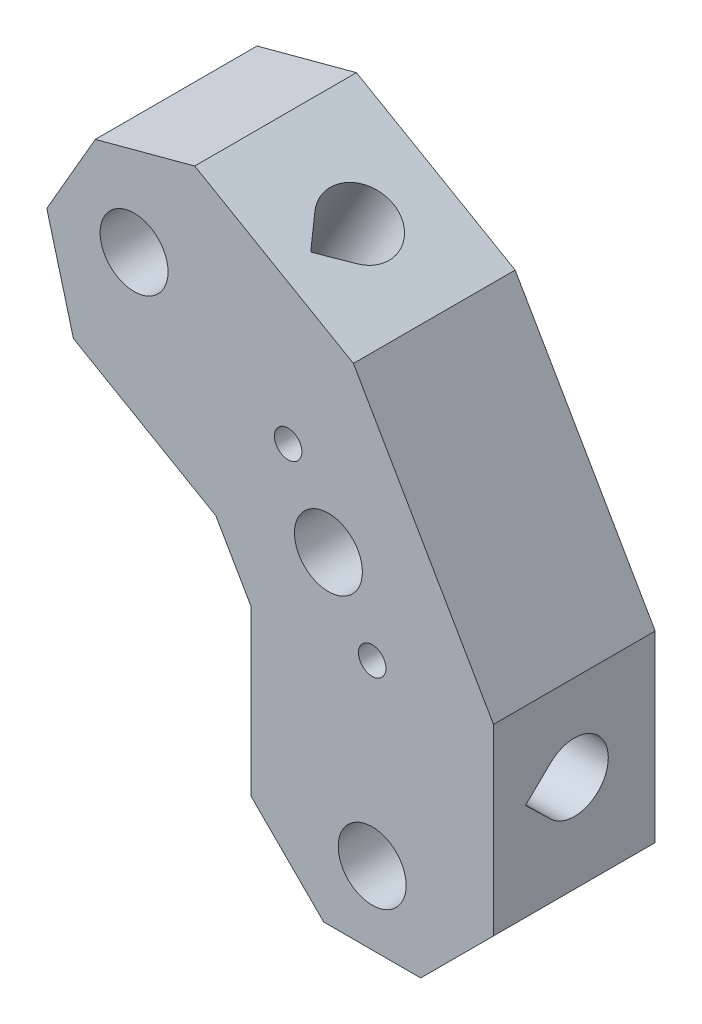
ISO-10303-21;
HEADER;
FILE_DESCRIPTION(('STEP AP214'),'2;1');
FILE_NAME('part.step','',(''),(''),'','','');
FILE_SCHEMA(('AUTOMOTIVE_DESIGN { 1 0 10303 214 1 1 1 1 }'));
ENDSEC;
DATA;
#1=APPLICATION_CONTEXT('core data for automotive mechanical design processes');
#2=APPLICATION_PROTOCOL_DEFINITION('international standard','automotive_design',2000,#1);
#3=PRODUCT_CONTEXT('',#1,'mechanical');
#4=PRODUCT('Part','Part','',(#3));
#5=PRODUCT_RELATED_PRODUCT_CATEGORY('part','',(#4));
#6=PRODUCT_DEFINITION_FORMATION('','',#4);
#7=PRODUCT_DEFINITION_CONTEXT('part definition',#1,'design');
#8=PRODUCT_DEFINITION('design','',#6,#7);
#9=PRODUCT_DEFINITION_SHAPE('','',#8);
#10=(LENGTH_UNIT() NAMED_UNIT(*) SI_UNIT(.MILLI.,.METRE.));
#11=(NAMED_UNIT(*) PLANE_ANGLE_UNIT() SI_UNIT($,.RADIAN.));
#12=(NAMED_UNIT(*) SI_UNIT($,.STERADIAN.) SOLID_ANGLE_UNIT());
#13=UNCERTAINTY_MEASURE_WITH_UNIT(LENGTH_MEASURE(1.E-05),#10,'distance_accuracy_value','');
#14=(GEOMETRIC_REPRESENTATION_CONTEXT(3) GLOBAL_UNCERTAINTY_ASSIGNED_CONTEXT((#13)) GLOBAL_UNIT_ASSIGNED_CONTEXT((#10,
#11,#12)) REPRESENTATION_CONTEXT('',''));
#15=CARTESIAN_POINT('',(0.,0.,0.));
#16=DIRECTION('',(0.,0.,1.));
#17=DIRECTION('',(1.,0.,0.));
#18=AXIS2_PLACEMENT_3D('',#15,#16,#17);
#19=CARTESIAN_POINT('',(0.,-49.,20.));
#20=DIRECTION('',(0.,0.,-1.));
#21=DIRECTION('',(-1.,0.,0.));
#22=AXIS2_PLACEMENT_3D('',#19,#20,#21);
#23=PLANE('',#22);
#24=CARTESIAN_POINT('',(0.,-34.,20.));
#25=DIRECTION('',(0.,0.,1.));
#26=DIRECTION('',(1.,0.,0.));
#27=AXIS2_PLACEMENT_3D('',#24,#25,#26);
#28=CIRCLE('',#27,4.20000000000001);
#29=CARTESIAN_POINT('',(4.20000000000001,-34.,20.));
#30=VERTEX_POINT('',#29);
#31=EDGE_CURVE('E473',#30,#30,#28,.T.);
#32=ORIENTED_EDGE('',*,*,#31,.F.);
#33=EDGE_LOOP('',(#32));
#34=FACE_BOUND('',#33,.T.);
#35=CARTESIAN_POINT('',(-29.4448637286709,17.,20.));
#36=DIRECTION('',(0.,0.,1.));
#37=DIRECTION('',(1.,0.,0.));
#38=AXIS2_PLACEMENT_3D('',#35,#36,#37);
#39=CIRCLE('',#38,4.20000000000002);
#40=CARTESIAN_POINT('',(-25.2448637286709,17.,20.));
#41=VERTEX_POINT('',#40);
#42=EDGE_CURVE('E469',#41,#41,#39,.T.);
#43=ORIENTED_EDGE('',*,*,#42,.F.);
#44=EDGE_LOOP('',(#43));
#45=FACE_BOUND('',#44,.T.);
#46=CARTESIAN_POINT('',(-5.41265877365275,-3.125,20.));
#47=DIRECTION('',(0.,0.,1.));
#48=DIRECTION('',(1.,0.,0.));
#49=AXIS2_PLACEMENT_3D('',#46,#47,#48);
#50=CIRCLE('',#49,4.20000000000001);
#51=CARTESIAN_POINT('',(-1.21265877365273,-3.125,20.));
#52=VERTEX_POINT('',#51);
#53=EDGE_CURVE('E465',#52,#52,#50,.T.);
#54=ORIENTED_EDGE('',*,*,#53,.F.);
#55=EDGE_LOOP('',(#54));
#56=FACE_BOUND('',#55,.T.);
#57=CARTESIAN_POINT('',(-10.3923048454133,5.99999999999996,20.));
#58=DIRECTION('',(0.,0.,1.));
#59=DIRECTION('',(1.,0.,0.));
#60=AXIS2_PLACEMENT_3D('',#57,#58,#59);
#61=CIRCLE('',#60,1.70000000000001);
#62=CARTESIAN_POINT('',(-8.69230484541329,5.99999999999996,20.));
#63=VERTEX_POINT('',#62);
#64=EDGE_CURVE('E461',#63,#63,#61,.T.);
#65=ORIENTED_EDGE('',*,*,#64,.F.);
#66=EDGE_LOOP('',(#65));
#67=FACE_BOUND('',#66,.T.);
#68=DIRECTION('',(0.707106781186547,-0.707106781186548,0.));
#69=VECTOR('',#68,1.);
#70=CARTESIAN_POINT('',(-15.,-34.,20.));
#71=LINE('',#70,#69);
#72=CARTESIAN_POINT('',(-15.,-34.,20.));
#73=VERTEX_POINT('',#72);
#74=CARTESIAN_POINT('',(-6.00000000000002,-43.,20.));
#75=VERTEX_POINT('',#74);
#76=EDGE_CURVE('E206',#73,#75,#71,.T.);
#77=ORIENTED_EDGE('',*,*,#76,.T.);
#78=DIRECTION('',(-1.,0.,0.));
#79=VECTOR('',#78,1.);
#80=CARTESIAN_POINT('',(-6.00000000000002,-43.,20.));
#81=LINE('',#80,#79);
#82=CARTESIAN_POINT('',(5.99999999999998,-43.,20.));
#83=VERTEX_POINT('',#82);
#84=EDGE_CURVE('E52',#75,#83,#81,.F.);
#85=ORIENTED_EDGE('',*,*,#84,.T.);
#86=DIRECTION('',(0.707106781186548,0.707106781186547,0.));
#87=VECTOR('',#86,1.);
#88=CARTESIAN_POINT('',(0.,-49.,20.));
#89=LINE('',#88,#87);
#90=CARTESIAN_POINT('',(15.,-34.,20.));
#91=VERTEX_POINT('',#90);
#92=EDGE_CURVE('E198',#83,#91,#89,.T.);
#93=ORIENTED_EDGE('',*,*,#92,.T.);
#94=DIRECTION('',(0.,1.,0.));
#95=VECTOR('',#94,1.);
#96=CARTESIAN_POINT('',(15.,-34.,20.));
#97=LINE('',#96,#95);
#98=CARTESIAN_POINT('',(15.,-11.3397459621556,20.));
#99=VERTEX_POINT('',#98);
#100=EDGE_CURVE('E230',#91,#99,#97,.T.);
#101=ORIENTED_EDGE('',*,*,#100,.T.);
#102=DIRECTION('',(-0.5,0.866025403784438,0.));
#103=VECTOR('',#102,1.);
#104=CARTESIAN_POINT('',(15.,-11.3397459621556,20.));
#105=LINE('',#104,#103);
#106=CARTESIAN_POINT('',(-2.32050807568878,18.6602540378444,20.));
#107=VERTEX_POINT('',#106);
#108=EDGE_CURVE('E233',#99,#107,#105,.T.);
#109=ORIENTED_EDGE('',*,*,#108,.T.);
#110=DIRECTION('',(-0.866025403784439,0.499999999999999,0.));
#111=VECTOR('',#110,1.);
#112=CARTESIAN_POINT('',(-2.32050807568878,18.6602540378444,20.));
#113=LINE('',#112,#111);
#114=CARTESIAN_POINT('',(-21.944863728671,29.9903810567666,20.));
#115=VERTEX_POINT('',#114);
#116=EDGE_CURVE('E236',#107,#115,#113,.T.);
#117=ORIENTED_EDGE('',*,*,#116,.T.);
#118=DIRECTION('',(-0.965925826289068,-0.258819045102522,0.));
#119=VECTOR('',#118,1.);
#120=CARTESIAN_POINT('',(-21.944863728671,29.9903810567666,20.));
#121=LINE('',#120,#119);
#122=CARTESIAN_POINT('',(-34.2390923627309,26.6961524227066,20.));
#123=VERTEX_POINT('',#122);
#124=EDGE_CURVE('E239',#115,#123,#121,.T.);
#125=ORIENTED_EDGE('',*,*,#124,.T.);
#126=DIRECTION('',(0.500000000000001,0.866025403784438,0.));
#127=VECTOR('',#126,1.);
#128=CARTESIAN_POINT('',(-34.2390923627309,26.6961524227066,20.));
#129=LINE('',#128,#127);
#130=CARTESIAN_POINT('',(-40.2390923627309,16.3038475772933,20.));
#131=VERTEX_POINT('',#130);
#132=EDGE_CURVE('E274',#123,#131,#129,.F.);
#133=ORIENTED_EDGE('',*,*,#132,.T.);
#134=DIRECTION('',(0.258819045102522,-0.965925826289068,0.));
#135=VECTOR('',#134,1.);
#136=CARTESIAN_POINT('',(-42.4352447854376,24.5,20.));
#137=LINE('',#136,#135);
#138=CARTESIAN_POINT('',(-36.9448637286709,4.00961894323339,20.));
#139=VERTEX_POINT('',#138);
#140=EDGE_CURVE('E242',#131,#139,#137,.T.);
#141=ORIENTED_EDGE('',*,*,#140,.T.);
#142=DIRECTION('',(0.866025403784439,-0.499999999999999,0.));
#143=VECTOR('',#142,1.);
#144=CARTESIAN_POINT('',(-36.9448637286709,4.00961894323339,20.));
#145=LINE('',#144,#143);
#146=CARTESIAN_POINT('',(-19.3301270189222,-6.16025403784441,20.));
#147=VERTEX_POINT('',#146);
#148=EDGE_CURVE('E244',#139,#147,#145,.T.);
#149=ORIENTED_EDGE('',*,*,#148,.T.);
#150=DIRECTION('',(-0.499999999999998,0.86602540378444,0.));
#151=VECTOR('',#150,1.);
#152=CARTESIAN_POINT('',(4.05255888325756,-46.6602540378445,20.));
#153=LINE('',#152,#151);
#154=CARTESIAN_POINT('',(-15.,-13.6602540378444,20.));
#155=VERTEX_POINT('',#154);
#156=EDGE_CURVE('E285',#147,#155,#153,.F.);
#157=ORIENTED_EDGE('',*,*,#156,.T.);
#158=DIRECTION('',(0.,-1.,0.));
#159=VECTOR('',#158,1.);
#160=CARTESIAN_POINT('',(-15.,-8.66025403784439,20.));
#161=LINE('',#160,#159);
#162=EDGE_CURVE('E247',#155,#73,#161,.T.);
#163=ORIENTED_EDGE('',*,*,#162,.T.);
#164=EDGE_LOOP('',(#77,#85,#93,#101,#109,#117,#125,#133,#141,#149,#157,#163));
#165=FACE_BOUND('',#164,.T.);
#166=CARTESIAN_POINT('',(0.,-12.,20.));
#167=DIRECTION('',(0.,0.,1.));
#168=DIRECTION('',(1.,0.,0.));
#169=AXIS2_PLACEMENT_3D('',#166,#167,#168);
#170=CIRCLE('',#169,1.70000000000001);
#171=CARTESIAN_POINT('',(1.69999999999997,-12.,20.));
#172=VERTEX_POINT('',#171);
#173=EDGE_CURVE('E455',#172,#172,#170,.T.);
#174=ORIENTED_EDGE('',*,*,#173,.F.);
#175=EDGE_LOOP('',(#174));
#176=FACE_BOUND('',#175,.T.);
#177=ADVANCED_FACE('F30',(#34,#45,#56,#67,#165,#176),#23,.F.);
#178=CARTESIAN_POINT('',(0.,-49.,0.));
#179=DIRECTION('',(0.707106781186548,-0.707106781186548,0.));
#180=DIRECTION('',(0.707106781186548,0.707106781186548,0.));
#181=AXIS2_PLACEMENT_3D('',#178,#179,#180);
#182=PLANE('',#181);
#183=ORIENTED_EDGE('',*,*,#92,.F.);
#184=DIRECTION('',(0.,0.,-1.));
#185=VECTOR('',#184,1.);
#186=CARTESIAN_POINT('',(5.99999999999998,-43.,0.));
#187=LINE('',#186,#185);
#188=CARTESIAN_POINT('',(5.99999999999998,-43.,0.));
#189=VERTEX_POINT('',#188);
#190=EDGE_CURVE('E38',#83,#189,#187,.T.);
#191=ORIENTED_EDGE('',*,*,#190,.T.);
#192=DIRECTION('',(0.707106781186548,0.707106781186547,0.));
#193=VECTOR('',#192,1.);
#194=CARTESIAN_POINT('',(0.,-49.,0.));
#195=LINE('',#194,#193);
#196=CARTESIAN_POINT('',(15.,-34.,0.));
#197=VERTEX_POINT('',#196);
#198=EDGE_CURVE('E203',#189,#197,#195,.T.);
#199=ORIENTED_EDGE('',*,*,#198,.T.);
#200=DIRECTION('',(0.,0.,1.));
#201=VECTOR('',#200,1.);
#202=CARTESIAN_POINT('',(15.,-34.,0.));
#203=LINE('',#202,#201);
#204=EDGE_CURVE('E228',#197,#91,#203,.T.);
#205=ORIENTED_EDGE('',*,*,#204,.T.);
#206=EDGE_LOOP('',(#183,#191,#199,#205));
#207=FACE_BOUND('',#206,.T.);
#208=ADVANCED_FACE('F318',(#207),#182,.T.);
#209=CARTESIAN_POINT('',(-15.,-34.,0.));
#210=DIRECTION('',(-0.707106781186548,-0.707106781186548,0.));
#211=DIRECTION('',(0.707106781186547,-0.707106781186548,0.));
#212=AXIS2_PLACEMENT_3D('',#209,#210,#211);
#213=PLANE('',#212);
#214=DIRECTION('',(0.707106781186547,-0.707106781186548,0.));
#215=VECTOR('',#214,1.);
#216=CARTESIAN_POINT('',(-15.,-34.,0.));
#217=LINE('',#216,#215);
#218=CARTESIAN_POINT('',(-15.,-34.,0.));
#219=VERTEX_POINT('',#218);
#220=CARTESIAN_POINT('',(-6.00000000000001,-43.,0.));
#221=VERTEX_POINT('',#220);
#222=EDGE_CURVE('E225',#219,#221,#217,.T.);
#223=ORIENTED_EDGE('',*,*,#222,.T.);
#224=DIRECTION('',(0.,0.,1.));
#225=VECTOR('',#224,1.);
#226=CARTESIAN_POINT('',(-6.00000000000002,-43.,0.));
#227=LINE('',#226,#225);
#228=EDGE_CURVE('E289',#221,#75,#227,.T.);
#229=ORIENTED_EDGE('',*,*,#228,.T.);
#230=ORIENTED_EDGE('',*,*,#76,.F.);
#231=DIRECTION('',(0.,0.,1.));
#232=VECTOR('',#231,1.);
#233=CARTESIAN_POINT('',(-15.,-34.,0.));
#234=LINE('',#233,#232);
#235=EDGE_CURVE('E250',#219,#73,#234,.T.);
#236=ORIENTED_EDGE('',*,*,#235,.F.);
#237=EDGE_LOOP('',(#223,#229,#230,#236));
#238=FACE_BOUND('',#237,.T.);
#239=ADVANCED_FACE('F295',(#238),#213,.T.);
#240=CARTESIAN_POINT('',(-15.,-8.66025403784439,0.));
#241=DIRECTION('',(-1.,0.,0.));
#242=DIRECTION('',(0.,-1.,0.));
#243=AXIS2_PLACEMENT_3D('',#240,#241,#242);
#244=PLANE('',#243);
#245=CARTESIAN_POINT('',(-15.,-22.,10.));
#246=DIRECTION('',(-1.,0.,0.));
#247=DIRECTION('',(0.,-1.,0.));
#248=AXIS2_PLACEMENT_3D('',#245,#246,#247);
#249=CIRCLE('',#248,4.2);
#250=CARTESIAN_POINT('',(-15.,-18.9787728385776,12.9175651559278));
#251=VERTEX_POINT('',#250);
#252=CARTESIAN_POINT('',(-15.,-25.0212271614223,12.9175651559278));
#253=VERTEX_POINT('',#252);
#254=EDGE_CURVE('E185',#251,#253,#249,.T.);
#255=ORIENTED_EDGE('',*,*,#254,.F.);
#256=DIRECTION('',(0.,0.694658370458998,-0.719339800338651));
#257=VECTOR('',#256,1.);
#258=CARTESIAN_POINT('',(-15.,-7.54472093251358,1.07725779774364));
#259=LINE('',#258,#257);
#260=CARTESIAN_POINT('',(-15.,-22.,16.046137466428));
#261=VERTEX_POINT('',#260);
#262=EDGE_CURVE('E181',#261,#251,#259,.T.);
#263=ORIENTED_EDGE('',*,*,#262,.F.);
#264=DIRECTION('',(0.,0.694658370458998,0.719339800338651));
#265=VECTOR('',#264,1.);
#266=CARTESIAN_POINT('',(-15.,-23.5810835255492,14.4088775470869));
#267=LINE('',#266,#265);
#268=EDGE_CURVE('E161',#253,#261,#267,.T.);
#269=ORIENTED_EDGE('',*,*,#268,.F.);
#270=EDGE_LOOP('',(#255,#263,#269));
#271=FACE_BOUND('',#270,.T.);
#272=ORIENTED_EDGE('',*,*,#162,.F.);
#273=DIRECTION('',(0.,0.,-1.));
#274=VECTOR('',#273,1.);
#275=CARTESIAN_POINT('',(-15.,-13.6602540378444,0.));
#276=LINE('',#275,#274);
#277=CARTESIAN_POINT('',(-15.,-13.6602540378444,0.));
#278=VERTEX_POINT('',#277);
#279=EDGE_CURVE('E283',#155,#278,#276,.T.);
#280=ORIENTED_EDGE('',*,*,#279,.T.);
#281=DIRECTION('',(0.,-1.,0.));
#282=VECTOR('',#281,1.);
#283=CARTESIAN_POINT('',(-15.,-8.66025403784439,0.));
#284=LINE('',#283,#282);
#285=EDGE_CURVE('E223',#278,#219,#284,.T.);
#286=ORIENTED_EDGE('',*,*,#285,.T.);
#287=ORIENTED_EDGE('',*,*,#235,.T.);
#288=EDGE_LOOP('',(#272,#280,#286,#287));
#289=FACE_BOUND('',#288,.T.);
#290=ADVANCED_FACE('F304',(#271,#289),#244,.T.);
#291=CARTESIAN_POINT('',(-36.9448637286709,4.00961894323339,0.));
#292=DIRECTION('',(-0.499999999999999,-0.866025403784439,0.));
#293=DIRECTION('',(0.866025403784439,-0.499999999999999,0.));
#294=AXIS2_PLACEMENT_3D('',#291,#292,#293);
#295=PLANE('',#294);
#296=CARTESIAN_POINT('',(-26.5525588832576,-1.99038105676662,10.));
#297=DIRECTION('',(-0.499999999999999,-0.866025403784439,0.));
#298=DIRECTION('',(0.866025403784439,-0.499999999999999,0.));
#299=AXIS2_PLACEMENT_3D('',#296,#297,#298);
#300=CIRCLE('',#299,4.2);
#301=CARTESIAN_POINT('',(-29.1690183556529,-0.479767476055451,12.9175651559278));
#302=VERTEX_POINT('',#301);
#303=CARTESIAN_POINT('',(-23.9360994108624,-3.50099463747778,12.9175651559278));
#304=VERTEX_POINT('',#303);
#305=EDGE_CURVE('E187',#302,#304,#300,.T.);
#306=ORIENTED_EDGE('',*,*,#305,.F.);
#307=DIRECTION('',(-0.601591795768994,0.347329185229498,-0.719339800338651));
#308=VECTOR('',#307,1.);
#309=CARTESIAN_POINT('',(-26.5525588832576,-1.99038105676662,16.046137466428));
#310=LINE('',#309,#308);
#311=CARTESIAN_POINT('',(-26.5525588832576,-1.99038105676662,16.046137466428));
#312=VERTEX_POINT('',#311);
#313=EDGE_CURVE('E192',#312,#302,#310,.T.);
#314=ORIENTED_EDGE('',*,*,#313,.F.);
#315=DIRECTION('',(-0.601591795768994,0.347329185229498,0.719339800338651));
#316=VECTOR('',#315,1.);
#317=CARTESIAN_POINT('',(-23.9360994108624,-3.50099463747778,12.9175651559278));
#318=LINE('',#317,#316);
#319=EDGE_CURVE('E189',#304,#312,#318,.T.);
#320=ORIENTED_EDGE('',*,*,#319,.F.);
#321=EDGE_LOOP('',(#306,#314,#320));
#322=FACE_BOUND('',#321,.T.);
#323=DIRECTION('',(0.866025403784439,-0.499999999999999,0.));
#324=VECTOR('',#323,1.);
#325=CARTESIAN_POINT('',(-36.9448637286709,4.00961894323339,0.));
#326=LINE('',#325,#324);
#327=CARTESIAN_POINT('',(-36.9448637286709,4.00961894323339,0.));
#328=VERTEX_POINT('',#327);
#329=CARTESIAN_POINT('',(-19.3301270189222,-6.16025403784441,0.));
#330=VERTEX_POINT('',#329);
#331=EDGE_CURVE('E220',#328,#330,#326,.T.);
#332=ORIENTED_EDGE('',*,*,#331,.T.);
#333=DIRECTION('',(0.,0.,1.));
#334=VECTOR('',#333,1.);
#335=CARTESIAN_POINT('',(-19.3301270189222,-6.16025403784441,20.));
#336=LINE('',#335,#334);
#337=EDGE_CURVE('E280',#330,#147,#336,.T.);
#338=ORIENTED_EDGE('',*,*,#337,.T.);
#339=ORIENTED_EDGE('',*,*,#148,.F.);
#340=DIRECTION('',(0.,0.,1.));
#341=VECTOR('',#340,1.);
#342=CARTESIAN_POINT('',(-36.9448637286709,4.00961894323339,0.));
#343=LINE('',#342,#341);
#344=EDGE_CURVE('E254',#328,#139,#343,.T.);
#345=ORIENTED_EDGE('',*,*,#344,.F.);
#346=EDGE_LOOP('',(#332,#338,#339,#345));
#347=FACE_BOUND('',#346,.T.);
#348=ADVANCED_FACE('F334',(#322,#347),#295,.T.);
#349=CARTESIAN_POINT('',(-42.4352447854376,24.5,0.));
#350=DIRECTION('',(-0.965925826289068,-0.258819045102522,0.));
#351=DIRECTION('',(0.258819045102522,-0.965925826289068,0.));
#352=AXIS2_PLACEMENT_3D('',#349,#350,#351);
#353=PLANE('',#352);
#354=ORIENTED_EDGE('',*,*,#140,.F.);
#355=DIRECTION('',(0.,0.,-1.));
#356=VECTOR('',#355,1.);
#357=CARTESIAN_POINT('',(-40.2390923627309,16.3038475772933,0.));
#358=LINE('',#357,#356);
#359=CARTESIAN_POINT('',(-40.2390923627309,16.3038475772933,0.));
#360=VERTEX_POINT('',#359);
#361=EDGE_CURVE('E276',#131,#360,#358,.T.);
#362=ORIENTED_EDGE('',*,*,#361,.T.);
#363=DIRECTION('',(0.258819045102522,-0.965925826289068,0.));
#364=VECTOR('',#363,1.);
#365=CARTESIAN_POINT('',(-42.4352447854376,24.5,0.));
#366=LINE('',#365,#364);
#367=EDGE_CURVE('E218',#360,#328,#366,.T.);
#368=ORIENTED_EDGE('',*,*,#367,.T.);
#369=ORIENTED_EDGE('',*,*,#344,.T.);
#370=EDGE_LOOP('',(#354,#362,#368,#369));
#371=FACE_BOUND('',#370,.T.);
#372=ADVANCED_FACE('F338',(#371),#353,.T.);
#373=CARTESIAN_POINT('',(-21.944863728671,29.9903810567666,0.));
#374=DIRECTION('',(-0.258819045102522,0.965925826289068,0.));
#375=DIRECTION('',(-0.965925826289068,-0.258819045102522,0.));
#376=AXIS2_PLACEMENT_3D('',#373,#374,#375);
#377=PLANE('',#376);
#378=DIRECTION('',(-0.965925826289068,-0.258819045102522,0.));
#379=VECTOR('',#378,1.);
#380=CARTESIAN_POINT('',(-21.944863728671,29.9903810567666,0.));
#381=LINE('',#380,#379);
#382=CARTESIAN_POINT('',(-21.944863728671,29.9903810567666,0.));
#383=VERTEX_POINT('',#382);
#384=CARTESIAN_POINT('',(-34.2390923627309,26.6961524227066,0.));
#385=VERTEX_POINT('',#384);
#386=EDGE_CURVE('E215',#383,#385,#381,.T.);
#387=ORIENTED_EDGE('',*,*,#386,.T.);
#388=DIRECTION('',(0.,0.,1.));
#389=VECTOR('',#388,1.);
#390=CARTESIAN_POINT('',(-34.2390923627309,26.6961524227066,0.));
#391=LINE('',#390,#389);
#392=EDGE_CURVE('E271',#385,#123,#391,.T.);
#393=ORIENTED_EDGE('',*,*,#392,.T.);
#394=ORIENTED_EDGE('',*,*,#124,.F.);
#395=DIRECTION('',(0.,0.,1.));
#396=VECTOR('',#395,1.);
#397=CARTESIAN_POINT('',(-21.944863728671,29.9903810567666,0.));
#398=LINE('',#397,#396);
#399=EDGE_CURVE('E257',#383,#115,#398,.T.);
#400=ORIENTED_EDGE('',*,*,#399,.F.);
#401=EDGE_LOOP('',(#387,#393,#394,#400));
#402=FACE_BOUND('',#401,.T.);
#403=ADVANCED_FACE('F342',(#402),#377,.T.);
#404=CARTESIAN_POINT('',(-2.32050807568878,18.6602540378444,0.));
#405=DIRECTION('',(0.499999999999999,0.86602540378444,0.));
#406=DIRECTION('',(-0.86602540378444,0.499999999999999,0.));
#407=AXIS2_PLACEMENT_3D('',#404,#405,#406);
#408=PLANE('',#407);
#409=CARTESIAN_POINT('',(-11.5525588832577,23.9903810567666,10.));
#410=DIRECTION('',(0.499999999999999,0.86602540378444,0.));
#411=DIRECTION('',(-0.86602540378444,0.499999999999999,0.));
#412=AXIS2_PLACEMENT_3D('',#409,#410,#411);
#413=CIRCLE('',#412,4.2);
#414=CARTESIAN_POINT('',(-8.93609941086238,22.4797674760554,12.9175651559278));
#415=VERTEX_POINT('',#414);
#416=CARTESIAN_POINT('',(-14.169018355653,25.5009946374777,12.9175651559278));
#417=VERTEX_POINT('',#416);
#418=EDGE_CURVE('E269',#415,#417,#413,.T.);
#419=ORIENTED_EDGE('',*,*,#418,.F.);
#420=DIRECTION('',(0.601591795768994,-0.347329185229498,-0.719339800338651));
#421=VECTOR('',#420,1.);
#422=CARTESIAN_POINT('',(-0.153681747897582,17.409236274207,2.4161876228578));
#423=LINE('',#422,#421);
#424=CARTESIAN_POINT('',(-11.5525588832577,23.9903810567666,16.046137466428));
#425=VERTEX_POINT('',#424);
#426=EDGE_CURVE('E253',#425,#415,#423,.T.);
#427=ORIENTED_EDGE('',*,*,#426,.F.);
#428=DIRECTION('',(0.601591795768994,-0.347329185229498,0.719339800338651));
#429=VECTOR('',#428,1.);
#430=CARTESIAN_POINT('',(-14.0415791377649,25.4274175707248,13.0699477219728));
#431=LINE('',#430,#429);
#432=EDGE_CURVE('E266',#417,#425,#431,.T.);
#433=ORIENTED_EDGE('',*,*,#432,.F.);
#434=EDGE_LOOP('',(#419,#427,#433));
#435=FACE_BOUND('',#434,.T.);
#436=ORIENTED_EDGE('',*,*,#116,.F.);
#437=DIRECTION('',(0.,0.,1.));
#438=VECTOR('',#437,1.);
#439=CARTESIAN_POINT('',(-2.32050807568878,18.6602540378444,0.));
#440=LINE('',#439,#438);
#441=CARTESIAN_POINT('',(-2.32050807568878,18.6602540378444,0.));
#442=VERTEX_POINT('',#441);
#443=EDGE_CURVE('E259',#442,#107,#440,.T.);
#444=ORIENTED_EDGE('',*,*,#443,.F.);
#445=DIRECTION('',(-0.866025403784439,0.499999999999999,0.));
#446=VECTOR('',#445,1.);
#447=CARTESIAN_POINT('',(-2.32050807568878,18.6602540378444,0.));
#448=LINE('',#447,#446);
#449=EDGE_CURVE('E212',#442,#383,#448,.T.);
#450=ORIENTED_EDGE('',*,*,#449,.T.);
#451=ORIENTED_EDGE('',*,*,#399,.T.);
#452=EDGE_LOOP('',(#436,#444,#450,#451));
#453=FACE_BOUND('',#452,.T.);
#454=ADVANCED_FACE('F346',(#435,#453),#408,.T.);
#455=CARTESIAN_POINT('',(15.,-11.3397459621556,0.));
#456=DIRECTION('',(0.866025403784438,0.500000000000001,0.));
#457=DIRECTION('',(-0.500000000000001,0.866025403784438,0.));
#458=AXIS2_PLACEMENT_3D('',#455,#456,#457);
#459=PLANE('',#458);
#460=ORIENTED_EDGE('',*,*,#108,.F.);
#461=DIRECTION('',(0.,0.,1.));
#462=VECTOR('',#461,1.);
#463=CARTESIAN_POINT('',(15.,-11.3397459621556,0.));
#464=LINE('',#463,#462);
#465=CARTESIAN_POINT('',(15.,-11.3397459621556,0.));
#466=VERTEX_POINT('',#465);
#467=EDGE_CURVE('E261',#466,#99,#464,.T.);
#468=ORIENTED_EDGE('',*,*,#467,.F.);
#469=DIRECTION('',(-0.5,0.866025403784438,0.));
#470=VECTOR('',#469,1.);
#471=CARTESIAN_POINT('',(15.,-11.3397459621556,0.));
#472=LINE('',#471,#470);
#473=EDGE_CURVE('E209',#466,#442,#472,.T.);
#474=ORIENTED_EDGE('',*,*,#473,.T.);
#475=ORIENTED_EDGE('',*,*,#443,.T.);
#476=EDGE_LOOP('',(#460,#468,#474,#475));
#477=FACE_BOUND('',#476,.T.);
#478=ADVANCED_FACE('F350',(#477),#459,.T.);
#479=CARTESIAN_POINT('',(15.,-34.,0.));
#480=DIRECTION('',(1.,0.,0.));
#481=DIRECTION('',(0.,1.,0.));
#482=AXIS2_PLACEMENT_3D('',#479,#480,#481);
#483=PLANE('',#482);
#484=CARTESIAN_POINT('',(15.,-22.,10.));
#485=DIRECTION('',(1.,0.,0.));
#486=DIRECTION('',(0.,1.,0.));
#487=AXIS2_PLACEMENT_3D('',#484,#485,#486);
#488=CIRCLE('',#487,4.2);
#489=CARTESIAN_POINT('',(15.,-25.0212271614223,12.9175651559278));
#490=VERTEX_POINT('',#489);
#491=CARTESIAN_POINT('',(15.,-18.9787728385776,12.9175651559278));
#492=VERTEX_POINT('',#491);
#493=EDGE_CURVE('E173',#490,#492,#488,.T.);
#494=ORIENTED_EDGE('',*,*,#493,.F.);
#495=DIRECTION('',(0.,-0.694658370458998,-0.719339800338651));
#496=VECTOR('',#495,1.);
#497=CARTESIAN_POINT('',(15.,-22.,16.046137466428));
#498=LINE('',#497,#496);
#499=CARTESIAN_POINT('',(15.,-22.,16.046137466428));
#500=VERTEX_POINT('',#499);
#501=EDGE_CURVE('E158',#500,#490,#498,.T.);
#502=ORIENTED_EDGE('',*,*,#501,.F.);
#503=DIRECTION('',(0.,-0.694658370458998,0.719339800338651));
#504=VECTOR('',#503,1.);
#505=CARTESIAN_POINT('',(15.,-18.9787728385776,12.9175651559278));
#506=LINE('',#505,#504);
#507=EDGE_CURVE('E169',#492,#500,#506,.T.);
#508=ORIENTED_EDGE('',*,*,#507,.F.);
#509=EDGE_LOOP('',(#494,#502,#508));
#510=FACE_BOUND('',#509,.T.);
#511=ORIENTED_EDGE('',*,*,#100,.F.);
#512=ORIENTED_EDGE('',*,*,#204,.F.);
#513=DIRECTION('',(0.,1.,0.));
#514=VECTOR('',#513,1.);
#515=CARTESIAN_POINT('',(15.,-34.,0.));
#516=LINE('',#515,#514);
#517=EDGE_CURVE('E205',#197,#466,#516,.T.);
#518=ORIENTED_EDGE('',*,*,#517,.T.);
#519=ORIENTED_EDGE('',*,*,#467,.T.);
#520=EDGE_LOOP('',(#511,#512,#518,#519));
#521=FACE_BOUND('',#520,.T.);
#522=ADVANCED_FACE('F175',(#510,#521),#483,.T.);
#523=CARTESIAN_POINT('',(0.,-49.,0.));
#524=DIRECTION('',(0.,0.,-1.));
#525=DIRECTION('',(-1.,0.,0.));
#526=AXIS2_PLACEMENT_3D('',#523,#524,#525);
#527=PLANE('',#526);
#528=CARTESIAN_POINT('',(0.,-34.,0.));
#529=DIRECTION('',(0.,0.,1.));
#530=DIRECTION('',(1.,0.,0.));
#531=AXIS2_PLACEMENT_3D('',#528,#529,#530);
#532=CIRCLE('',#531,4.20000000000001);
#533=CARTESIAN_POINT('',(4.20000000000001,-34.,0.));
#534=VERTEX_POINT('',#533);
#535=EDGE_CURVE('E439',#534,#534,#532,.T.);
#536=ORIENTED_EDGE('',*,*,#535,.T.);
#537=EDGE_LOOP('',(#536));
#538=FACE_BOUND('',#537,.T.);
#539=CARTESIAN_POINT('',(-29.4448637286709,17.,0.));
#540=DIRECTION('',(0.,0.,1.));
#541=DIRECTION('',(1.,0.,0.));
#542=AXIS2_PLACEMENT_3D('',#539,#540,#541);
#543=CIRCLE('',#542,4.20000000000001);
#544=CARTESIAN_POINT('',(-25.2448637286709,17.,0.));
#545=VERTEX_POINT('',#544);
#546=EDGE_CURVE('E443',#545,#545,#543,.T.);
#547=ORIENTED_EDGE('',*,*,#546,.T.);
#548=EDGE_LOOP('',(#547));
#549=FACE_BOUND('',#548,.T.);
#550=CARTESIAN_POINT('',(-5.41265877365275,-3.125,0.));
#551=DIRECTION('',(0.,0.,1.));
#552=DIRECTION('',(1.,0.,0.));
#553=AXIS2_PLACEMENT_3D('',#550,#551,#552);
#554=CIRCLE('',#553,4.20000000000001);
#555=CARTESIAN_POINT('',(-1.21265877365273,-3.125,0.));
#556=VERTEX_POINT('',#555);
#557=EDGE_CURVE('E447',#556,#556,#554,.T.);
#558=ORIENTED_EDGE('',*,*,#557,.T.);
#559=EDGE_LOOP('',(#558));
#560=FACE_BOUND('',#559,.T.);
#561=CARTESIAN_POINT('',(-10.3923048454133,5.99999999999996,0.));
#562=DIRECTION('',(0.,0.,1.));
#563=DIRECTION('',(1.,0.,0.));
#564=AXIS2_PLACEMENT_3D('',#561,#562,#563);
#565=CIRCLE('',#564,1.70000000000001);
#566=CARTESIAN_POINT('',(-8.69230484541329,5.99999999999996,0.));
#567=VERTEX_POINT('',#566);
#568=EDGE_CURVE('E451',#567,#567,#565,.T.);
#569=ORIENTED_EDGE('',*,*,#568,.T.);
#570=EDGE_LOOP('',(#569));
#571=FACE_BOUND('',#570,.T.);
#572=CARTESIAN_POINT('',(0.,-12.,0.));
#573=DIRECTION('',(0.,0.,1.));
#574=DIRECTION('',(1.,0.,0.));
#575=AXIS2_PLACEMENT_3D('',#572,#573,#574);
#576=CIRCLE('',#575,1.70000000000001);
#577=CARTESIAN_POINT('',(1.69999999999997,-12.,0.));
#578=VERTEX_POINT('',#577);
#579=EDGE_CURVE('E454',#578,#578,#576,.T.);
#580=ORIENTED_EDGE('',*,*,#579,.T.);
#581=EDGE_LOOP('',(#580));
#582=FACE_BOUND('',#581,.T.);
#583=ORIENTED_EDGE('',*,*,#198,.F.);
#584=DIRECTION('',(1.,0.,0.));
#585=VECTOR('',#584,1.);
#586=CARTESIAN_POINT('',(0.,-43.,0.));
#587=LINE('',#586,#585);
#588=EDGE_CURVE('E11',#189,#221,#587,.F.);
#589=ORIENTED_EDGE('',*,*,#588,.T.);
#590=ORIENTED_EDGE('',*,*,#222,.F.);
#591=ORIENTED_EDGE('',*,*,#285,.F.);
#592=DIRECTION('',(0.499999999999998,-0.86602540378444,0.));
#593=VECTOR('',#592,1.);
#594=CARTESIAN_POINT('',(-19.3301270189222,-6.16025403784441,0.));
#595=LINE('',#594,#593);
#596=EDGE_CURVE('E287',#278,#330,#595,.F.);
#597=ORIENTED_EDGE('',*,*,#596,.T.);
#598=ORIENTED_EDGE('',*,*,#331,.F.);
#599=ORIENTED_EDGE('',*,*,#367,.F.);
#600=DIRECTION('',(-0.500000000000001,-0.866025403784438,0.));
#601=VECTOR('',#600,1.);
#602=CARTESIAN_POINT('',(-58.4567147554496,-15.2499999999999,0.));
#603=LINE('',#602,#601);
#604=EDGE_CURVE('E278',#360,#385,#603,.F.);
#605=ORIENTED_EDGE('',*,*,#604,.T.);
#606=ORIENTED_EDGE('',*,*,#386,.F.);
#607=ORIENTED_EDGE('',*,*,#449,.F.);
#608=ORIENTED_EDGE('',*,*,#473,.F.);
#609=ORIENTED_EDGE('',*,*,#517,.F.);
#610=EDGE_LOOP('',(#583,#589,#590,#591,#597,#598,#599,#605,#606,#607,#608,#609));
#611=FACE_BOUND('',#610,.T.);
#612=ADVANCED_FACE('F307',(#538,#549,#560,#571,#582,#611),#527,.T.);
#613=CARTESIAN_POINT('',(-2.31634295108996,39.9879763209582,10.));
#614=DIRECTION('',(-0.499999999999999,-0.866025403784439,0.));
#615=DIRECTION('',(0.866025403784439,-0.499999999999999,0.));
#616=AXIS2_PLACEMENT_3D('',#613,#614,#615);
#617=CYLINDRICAL_SURFACE('',#616,4.2);
#618=ORIENTED_EDGE('',*,*,#418,.T.);
#619=DIRECTION('',(-0.499999999999999,-0.866025403784439,0.));
#620=VECTOR('',#619,1.);
#621=CARTESIAN_POINT('',(-4.93280242348525,41.4985899016694,12.9175651559278));
#622=LINE('',#621,#620);
#623=EDGE_CURVE('E196',#417,#302,#622,.T.);
#624=ORIENTED_EDGE('',*,*,#623,.T.);
#625=ORIENTED_EDGE('',*,*,#305,.T.);
#626=DIRECTION('',(-0.499999999999999,-0.866025403784439,0.));
#627=VECTOR('',#626,1.);
#628=CARTESIAN_POINT('',(0.300116521305328,38.4773627402471,12.9175651559278));
#629=LINE('',#628,#627);
#630=EDGE_CURVE('E195',#415,#304,#629,.T.);
#631=ORIENTED_EDGE('',*,*,#630,.F.);
#632=EDGE_LOOP('',(#618,#624,#625,#631));
#633=FACE_BOUND('',#632,.T.);
#634=ADVANCED_FACE('F417',(#633),#617,.F.);
#635=CARTESIAN_POINT('',(-2.31634295108996,39.9879763209582,16.046137466428));
#636=DIRECTION('',(-0.622966541046498,0.359669900169325,0.694658370458997));
#637=DIRECTION('',(0.744479207661403,0.,0.667645646552008));
#638=AXIS2_PLACEMENT_3D('',#635,#636,#637);
#639=PLANE('',#638);
#640=ORIENTED_EDGE('',*,*,#432,.T.);
#641=DIRECTION('',(-0.499999999999999,-0.866025403784439,0.));
#642=VECTOR('',#641,1.);
#643=CARTESIAN_POINT('',(-2.31634295108996,39.9879763209582,16.046137466428));
#644=LINE('',#643,#642);
#645=EDGE_CURVE('E199',#425,#312,#644,.T.);
#646=ORIENTED_EDGE('',*,*,#645,.T.);
#647=ORIENTED_EDGE('',*,*,#313,.T.);
#648=ORIENTED_EDGE('',*,*,#623,.F.);
#649=EDGE_LOOP('',(#640,#646,#647,#648));
#650=FACE_BOUND('',#649,.T.);
#651=ADVANCED_FACE('F414',(#650),#639,.F.);
#652=CARTESIAN_POINT('',(0.300116521305328,38.4773627402471,12.9175651559278));
#653=DIRECTION('',(0.622966541046498,-0.359669900169325,0.694658370458997));
#654=DIRECTION('',(0.744479207661403,0.,-0.667645646552009));
#655=AXIS2_PLACEMENT_3D('',#652,#653,#654);
#656=PLANE('',#655);
#657=ORIENTED_EDGE('',*,*,#426,.T.);
#658=ORIENTED_EDGE('',*,*,#630,.T.);
#659=ORIENTED_EDGE('',*,*,#319,.T.);
#660=ORIENTED_EDGE('',*,*,#645,.F.);
#661=EDGE_LOOP('',(#657,#658,#659,#660));
#662=FACE_BOUND('',#661,.T.);
#663=ADVANCED_FACE('F412',(#662),#656,.F.);
#664=CARTESIAN_POINT('',(-42.4352447854376,-22.,10.));
#665=DIRECTION('',(1.,0.,0.));
#666=DIRECTION('',(0.,1.,0.));
#667=AXIS2_PLACEMENT_3D('',#664,#665,#666);
#668=CYLINDRICAL_SURFACE('',#667,4.2);
#669=ORIENTED_EDGE('',*,*,#254,.T.);
#670=DIRECTION('',(1.,0.,0.));
#671=VECTOR('',#670,1.);
#672=CARTESIAN_POINT('',(-42.4352447854376,-25.0212271614223,12.9175651559278));
#673=LINE('',#672,#671);
#674=EDGE_CURVE('E164',#253,#490,#673,.T.);
#675=ORIENTED_EDGE('',*,*,#674,.T.);
#676=ORIENTED_EDGE('',*,*,#493,.T.);
#677=DIRECTION('',(1.,0.,0.));
#678=VECTOR('',#677,1.);
#679=CARTESIAN_POINT('',(-42.4352447854376,-18.9787728385776,12.9175651559278));
#680=LINE('',#679,#678);
#681=EDGE_CURVE('E165',#251,#492,#680,.T.);
#682=ORIENTED_EDGE('',*,*,#681,.F.);
#683=EDGE_LOOP('',(#669,#675,#676,#682));
#684=FACE_BOUND('',#683,.T.);
#685=ADVANCED_FACE('F407',(#684),#668,.F.);
#686=CARTESIAN_POINT('',(-42.4352447854376,-22.,16.046137466428));
#687=DIRECTION('',(0.,-0.719339800338651,0.694658370458998));
#688=DIRECTION('',(0.,-0.694658370458998,-0.719339800338651));
#689=AXIS2_PLACEMENT_3D('',#686,#687,#688);
#690=PLANE('',#689);
#691=ORIENTED_EDGE('',*,*,#268,.T.);
#692=DIRECTION('',(1.,0.,0.));
#693=VECTOR('',#692,1.);
#694=CARTESIAN_POINT('',(-42.4352447854376,-22.,16.046137466428));
#695=LINE('',#694,#693);
#696=EDGE_CURVE('E153',#261,#500,#695,.T.);
#697=ORIENTED_EDGE('',*,*,#696,.T.);
#698=ORIENTED_EDGE('',*,*,#501,.T.);
#699=ORIENTED_EDGE('',*,*,#674,.F.);
#700=EDGE_LOOP('',(#691,#697,#698,#699));
#701=FACE_BOUND('',#700,.T.);
#702=ADVANCED_FACE('F155',(#701),#690,.F.);
#703=CARTESIAN_POINT('',(-42.4352447854376,-18.9787728385776,12.9175651559278));
#704=DIRECTION('',(0.,0.719339800338651,0.694658370458998));
#705=DIRECTION('',(0.,-0.694658370458998,0.719339800338651));
#706=AXIS2_PLACEMENT_3D('',#703,#704,#705);
#707=PLANE('',#706);
#708=ORIENTED_EDGE('',*,*,#262,.T.);
#709=ORIENTED_EDGE('',*,*,#681,.T.);
#710=ORIENTED_EDGE('',*,*,#507,.T.);
#711=ORIENTED_EDGE('',*,*,#696,.F.);
#712=EDGE_LOOP('',(#708,#709,#710,#711));
#713=FACE_BOUND('',#712,.T.);
#714=ADVANCED_FACE('F170',(#713),#707,.F.);
#715=CARTESIAN_POINT('',(0.,-12.,20.));
#716=DIRECTION('',(0.,0.,1.));
#717=DIRECTION('',(1.,0.,0.));
#718=AXIS2_PLACEMENT_3D('',#715,#716,#717);
#719=CYLINDRICAL_SURFACE('',#718,1.70000000000001);
#720=ORIENTED_EDGE('',*,*,#579,.F.);
#721=EDGE_LOOP('',(#720));
#722=FACE_BOUND('',#721,.T.);
#723=ORIENTED_EDGE('',*,*,#173,.T.);
#724=EDGE_LOOP('',(#723));
#725=FACE_BOUND('',#724,.T.);
#726=ADVANCED_FACE('F400',(#722,#725),#719,.F.);
#727=CARTESIAN_POINT('',(-10.3923048454133,5.99999999999996,20.));
#728=DIRECTION('',(0.,0.,1.));
#729=DIRECTION('',(1.,0.,0.));
#730=AXIS2_PLACEMENT_3D('',#727,#728,#729);
#731=CYLINDRICAL_SURFACE('',#730,1.70000000000001);
#732=ORIENTED_EDGE('',*,*,#568,.F.);
#733=EDGE_LOOP('',(#732));
#734=FACE_BOUND('',#733,.T.);
#735=ORIENTED_EDGE('',*,*,#64,.T.);
#736=EDGE_LOOP('',(#735));
#737=FACE_BOUND('',#736,.T.);
#738=ADVANCED_FACE('F396',(#734,#737),#731,.F.);
#739=CARTESIAN_POINT('',(-5.41265877365275,-3.125,20.));
#740=DIRECTION('',(0.,0.,1.));
#741=DIRECTION('',(1.,0.,0.));
#742=AXIS2_PLACEMENT_3D('',#739,#740,#741);
#743=CYLINDRICAL_SURFACE('',#742,4.20000000000001);
#744=ORIENTED_EDGE('',*,*,#557,.F.);
#745=EDGE_LOOP('',(#744));
#746=FACE_BOUND('',#745,.T.);
#747=ORIENTED_EDGE('',*,*,#53,.T.);
#748=EDGE_LOOP('',(#747));
#749=FACE_BOUND('',#748,.T.);
#750=ADVANCED_FACE('F388',(#746,#749),#743,.F.);
#751=CARTESIAN_POINT('',(-29.4448637286709,17.,20.));
#752=DIRECTION('',(0.,0.,1.));
#753=DIRECTION('',(1.,0.,0.));
#754=AXIS2_PLACEMENT_3D('',#751,#752,#753);
#755=CYLINDRICAL_SURFACE('',#754,4.20000000000001);
#756=ORIENTED_EDGE('',*,*,#546,.F.);
#757=EDGE_LOOP('',(#756));
#758=FACE_BOUND('',#757,.T.);
#759=ORIENTED_EDGE('',*,*,#42,.T.);
#760=EDGE_LOOP('',(#759));
#761=FACE_BOUND('',#760,.T.);
#762=ADVANCED_FACE('F363',(#758,#761),#755,.F.);
#763=CARTESIAN_POINT('',(0.,-34.,20.));
#764=DIRECTION('',(0.,0.,1.));
#765=DIRECTION('',(1.,0.,0.));
#766=AXIS2_PLACEMENT_3D('',#763,#764,#765);
#767=CYLINDRICAL_SURFACE('',#766,4.20000000000001);
#768=ORIENTED_EDGE('',*,*,#535,.F.);
#769=EDGE_LOOP('',(#768));
#770=FACE_BOUND('',#769,.T.);
#771=ORIENTED_EDGE('',*,*,#31,.T.);
#772=EDGE_LOOP('',(#771));
#773=FACE_BOUND('',#772,.T.);
#774=ADVANCED_FACE('F358',(#770,#773),#767,.F.);
#775=CARTESIAN_POINT('',(-34.2390923627309,26.6961524227066,0.));
#776=DIRECTION('',(0.866025403784438,-0.500000000000001,0.));
#777=DIRECTION('',(0.500000000000001,0.866025403784438,0.));
#778=AXIS2_PLACEMENT_3D('',#775,#776,#777);
#779=PLANE('',#778);
#780=ORIENTED_EDGE('',*,*,#604,.F.);
#781=ORIENTED_EDGE('',*,*,#361,.F.);
#782=ORIENTED_EDGE('',*,*,#132,.F.);
#783=ORIENTED_EDGE('',*,*,#392,.F.);
#784=EDGE_LOOP('',(#780,#781,#782,#783));
#785=FACE_BOUND('',#784,.T.);
#786=ADVANCED_FACE('F315',(#785),#779,.F.);
#787=CARTESIAN_POINT('',(-19.3301270189222,-6.16025403784441,0.));
#788=DIRECTION('',(-0.86602540378444,-0.499999999999998,0.));
#789=DIRECTION('',(0.499999999999998,-0.86602540378444,0.));
#790=AXIS2_PLACEMENT_3D('',#787,#788,#789);
#791=PLANE('',#790);
#792=ORIENTED_EDGE('',*,*,#596,.F.);
#793=ORIENTED_EDGE('',*,*,#279,.F.);
#794=ORIENTED_EDGE('',*,*,#156,.F.);
#795=ORIENTED_EDGE('',*,*,#337,.F.);
#796=EDGE_LOOP('',(#792,#793,#794,#795));
#797=FACE_BOUND('',#796,.T.);
#798=ADVANCED_FACE('F311',(#797),#791,.T.);
#799=CARTESIAN_POINT('',(-6.00000000000002,-43.,0.));
#800=DIRECTION('',(0.,1.,0.));
#801=DIRECTION('',(-1.,0.,0.));
#802=AXIS2_PLACEMENT_3D('',#799,#800,#801);
#803=PLANE('',#802);
#804=ORIENTED_EDGE('',*,*,#588,.F.);
#805=ORIENTED_EDGE('',*,*,#190,.F.);
#806=ORIENTED_EDGE('',*,*,#84,.F.);
#807=ORIENTED_EDGE('',*,*,#228,.F.);
#808=EDGE_LOOP('',(#804,#805,#806,#807));
#809=FACE_BOUND('',#808,.T.);
#810=ADVANCED_FACE('F32',(#809),#803,.F.);
#811=CLOSED_SHELL('',(#177,#208,#239,#290,#348,#372,#403,#454,#478,#522,#612,#634,#651,#663,
#685,#702,#714,#726,#738,#750,#762,#774,#786,#798,#810));
#812=MANIFOLD_SOLID_BREP('B2',#811);
#813=ADVANCED_BREP_SHAPE_REPRESENTATION('',(#18,#812),#14);
#814=SHAPE_DEFINITION_REPRESENTATION(#9,#813);
ENDSEC;
END-ISO-10303-21;
